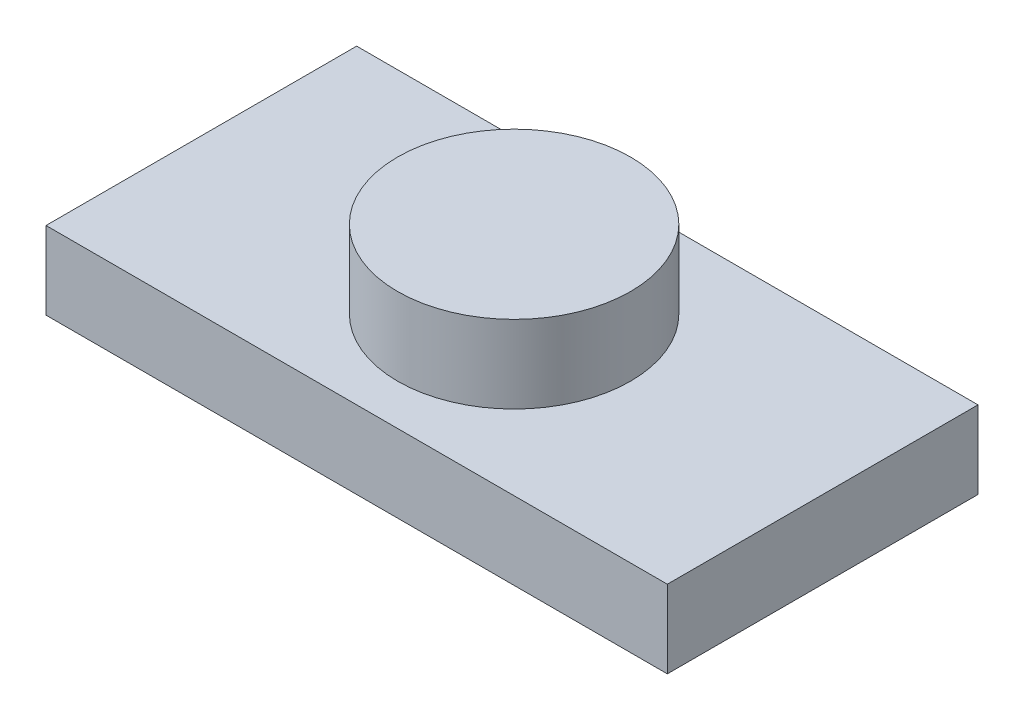
ISO-10303-21;
HEADER;
FILE_DESCRIPTION(('STEP AP214'),'2;1');
FILE_NAME('part.step','',(''),(''),'','','');
FILE_SCHEMA(('AUTOMOTIVE_DESIGN { 1 0 10303 214 1 1 1 1 }'));
ENDSEC;
DATA;
#1=APPLICATION_CONTEXT('core data for automotive mechanical design processes');
#2=APPLICATION_PROTOCOL_DEFINITION('international standard','automotive_design',2000,#1);
#3=PRODUCT_CONTEXT('',#1,'mechanical');
#4=PRODUCT('Part','Part','',(#3));
#5=PRODUCT_RELATED_PRODUCT_CATEGORY('part','',(#4));
#6=PRODUCT_DEFINITION_FORMATION('','',#4);
#7=PRODUCT_DEFINITION_CONTEXT('part definition',#1,'design');
#8=PRODUCT_DEFINITION('design','',#6,#7);
#9=PRODUCT_DEFINITION_SHAPE('','',#8);
#10=(LENGTH_UNIT() NAMED_UNIT(*) SI_UNIT(.MILLI.,.METRE.));
#11=(NAMED_UNIT(*) PLANE_ANGLE_UNIT() SI_UNIT($,.RADIAN.));
#12=(NAMED_UNIT(*) SI_UNIT($,.STERADIAN.) SOLID_ANGLE_UNIT());
#13=UNCERTAINTY_MEASURE_WITH_UNIT(LENGTH_MEASURE(1.E-05),#10,'distance_accuracy_value','');
#14=(GEOMETRIC_REPRESENTATION_CONTEXT(3) GLOBAL_UNCERTAINTY_ASSIGNED_CONTEXT((#13)) GLOBAL_UNIT_ASSIGNED_CONTEXT((#10,
#11,#12)) REPRESENTATION_CONTEXT('',''));
#15=CARTESIAN_POINT('',(0.,0.,0.));
#16=DIRECTION('',(0.,0.,1.));
#17=DIRECTION('',(1.,0.,0.));
#18=AXIS2_PLACEMENT_3D('',#15,#16,#17);
#19=CARTESIAN_POINT('',(20.,0.622119815668205,20.));
#20=DIRECTION('',(-1.,0.,0.));
#21=DIRECTION('',(0.,0.,1.));
#22=AXIS2_PLACEMENT_3D('',#19,#20,#21);
#23=PLANE('',#22);
#24=DIRECTION('',(0.,1.,0.));
#25=VECTOR('',#24,1.);
#26=CARTESIAN_POINT('',(20.,0.622119815668205,0.));
#27=LINE('',#26,#25);
#28=CARTESIAN_POINT('',(20.,0.622119815668205,0.));
#29=VERTEX_POINT('',#28);
#30=CARTESIAN_POINT('',(20.,5.6221198156682,0.));
#31=VERTEX_POINT('',#30);
#32=EDGE_CURVE('E109',#29,#31,#27,.T.);
#33=ORIENTED_EDGE('',*,*,#32,.T.);
#34=DIRECTION('',(0.,0.,-1.));
#35=VECTOR('',#34,1.);
#36=CARTESIAN_POINT('',(20.,5.6221198156682,20.));
#37=LINE('',#36,#35);
#38=CARTESIAN_POINT('',(20.,5.6221198156682,20.));
#39=VERTEX_POINT('',#38);
#40=EDGE_CURVE('E46',#39,#31,#37,.T.);
#41=ORIENTED_EDGE('',*,*,#40,.F.);
#42=DIRECTION('',(0.,1.,0.));
#43=VECTOR('',#42,1.);
#44=CARTESIAN_POINT('',(20.,0.622119815668205,20.));
#45=LINE('',#44,#43);
#46=CARTESIAN_POINT('',(20.,0.622119815668205,20.));
#47=VERTEX_POINT('',#46);
#48=EDGE_CURVE('E96',#47,#39,#45,.T.);
#49=ORIENTED_EDGE('',*,*,#48,.F.);
#50=DIRECTION('',(0.,0.,-1.));
#51=VECTOR('',#50,1.);
#52=CARTESIAN_POINT('',(20.,0.622119815668205,20.));
#53=LINE('',#52,#51);
#54=EDGE_CURVE('E105',#47,#29,#53,.T.);
#55=ORIENTED_EDGE('',*,*,#54,.T.);
#56=EDGE_LOOP('',(#33,#41,#49,#55));
#57=FACE_BOUND('',#56,.T.);
#58=ADVANCED_FACE('F43',(#57),#23,.F.);
#59=CARTESIAN_POINT('',(-20.,5.6221198156682,20.));
#60=DIRECTION('',(0.,-1.,0.));
#61=DIRECTION('',(0.,0.,-1.));
#62=AXIS2_PLACEMENT_3D('',#59,#60,#61);
#63=PLANE('',#62);
#64=CARTESIAN_POINT('',(0.,5.6221198156682,9.86491624432913));
#65=DIRECTION('',(0.,1.,0.));
#66=DIRECTION('',(0.,0.,1.));
#67=AXIS2_PLACEMENT_3D('',#64,#65,#66);
#68=CIRCLE('',#67,7.5);
#69=CARTESIAN_POINT('',(0.,5.6221198156682,17.3649162443291));
#70=VERTEX_POINT('',#69);
#71=EDGE_CURVE('E11',#70,#70,#68,.T.);
#72=ORIENTED_EDGE('',*,*,#71,.F.);
#73=EDGE_LOOP('',(#72));
#74=FACE_BOUND('',#73,.T.);
#75=DIRECTION('',(-1.,0.,0.));
#76=VECTOR('',#75,1.);
#77=CARTESIAN_POINT('',(-20.,5.6221198156682,0.));
#78=LINE('',#77,#76);
#79=CARTESIAN_POINT('',(-20.,5.6221198156682,0.));
#80=VERTEX_POINT('',#79);
#81=EDGE_CURVE('E101',#31,#80,#78,.T.);
#82=ORIENTED_EDGE('',*,*,#81,.T.);
#83=DIRECTION('',(0.,0.,-1.));
#84=VECTOR('',#83,1.);
#85=CARTESIAN_POINT('',(-20.,5.6221198156682,20.));
#86=LINE('',#85,#84);
#87=CARTESIAN_POINT('',(-20.,5.6221198156682,20.));
#88=VERTEX_POINT('',#87);
#89=EDGE_CURVE('E99',#88,#80,#86,.T.);
#90=ORIENTED_EDGE('',*,*,#89,.F.);
#91=DIRECTION('',(-1.,0.,0.));
#92=VECTOR('',#91,1.);
#93=CARTESIAN_POINT('',(-20.,5.6221198156682,20.));
#94=LINE('',#93,#92);
#95=EDGE_CURVE('E91',#39,#88,#94,.T.);
#96=ORIENTED_EDGE('',*,*,#95,.F.);
#97=ORIENTED_EDGE('',*,*,#40,.T.);
#98=EDGE_LOOP('',(#82,#90,#96,#97));
#99=FACE_BOUND('',#98,.T.);
#100=ADVANCED_FACE('F100',(#74,#99),#63,.F.);
#101=CARTESIAN_POINT('',(-20.,0.622119815668205,20.));
#102=DIRECTION('',(1.,0.,0.));
#103=DIRECTION('',(0.,0.,-1.));
#104=AXIS2_PLACEMENT_3D('',#101,#102,#103);
#105=PLANE('',#104);
#106=DIRECTION('',(0.,-1.,0.));
#107=VECTOR('',#106,1.);
#108=CARTESIAN_POINT('',(-20.,0.622119815668205,0.));
#109=LINE('',#108,#107);
#110=CARTESIAN_POINT('',(-20.,0.622119815668205,0.));
#111=VERTEX_POINT('',#110);
#112=EDGE_CURVE('E77',#80,#111,#109,.T.);
#113=ORIENTED_EDGE('',*,*,#112,.T.);
#114=DIRECTION('',(0.,0.,-1.));
#115=VECTOR('',#114,1.);
#116=CARTESIAN_POINT('',(-20.,0.622119815668205,20.));
#117=LINE('',#116,#115);
#118=CARTESIAN_POINT('',(-20.,0.622119815668205,20.));
#119=VERTEX_POINT('',#118);
#120=EDGE_CURVE('E102',#119,#111,#117,.T.);
#121=ORIENTED_EDGE('',*,*,#120,.F.);
#122=DIRECTION('',(0.,-1.,0.));
#123=VECTOR('',#122,1.);
#124=CARTESIAN_POINT('',(-20.,0.622119815668205,20.));
#125=LINE('',#124,#123);
#126=EDGE_CURVE('E94',#88,#119,#125,.T.);
#127=ORIENTED_EDGE('',*,*,#126,.F.);
#128=ORIENTED_EDGE('',*,*,#89,.T.);
#129=EDGE_LOOP('',(#113,#121,#127,#128));
#130=FACE_BOUND('',#129,.T.);
#131=ADVANCED_FACE('F103',(#130),#105,.F.);
#132=CARTESIAN_POINT('',(-20.,0.622119815668205,20.));
#133=DIRECTION('',(0.,1.,0.));
#134=DIRECTION('',(0.,0.,1.));
#135=AXIS2_PLACEMENT_3D('',#132,#133,#134);
#136=PLANE('',#135);
#137=DIRECTION('',(1.,0.,0.));
#138=VECTOR('',#137,1.);
#139=CARTESIAN_POINT('',(-20.,0.622119815668205,0.));
#140=LINE('',#139,#138);
#141=EDGE_CURVE('E83',#111,#29,#140,.T.);
#142=ORIENTED_EDGE('',*,*,#141,.T.);
#143=ORIENTED_EDGE('',*,*,#54,.F.);
#144=DIRECTION('',(1.,0.,0.));
#145=VECTOR('',#144,1.);
#146=CARTESIAN_POINT('',(-20.,0.622119815668205,20.));
#147=LINE('',#146,#145);
#148=EDGE_CURVE('E60',#119,#47,#147,.T.);
#149=ORIENTED_EDGE('',*,*,#148,.F.);
#150=ORIENTED_EDGE('',*,*,#120,.T.);
#151=EDGE_LOOP('',(#142,#143,#149,#150));
#152=FACE_BOUND('',#151,.T.);
#153=ADVANCED_FACE('F117',(#152),#136,.F.);
#154=CARTESIAN_POINT('',(0.,0.,20.));
#155=DIRECTION('',(0.,0.,-1.));
#156=DIRECTION('',(-1.,0.,0.));
#157=AXIS2_PLACEMENT_3D('',#154,#155,#156);
#158=PLANE('',#157);
#159=ORIENTED_EDGE('',*,*,#48,.T.);
#160=ORIENTED_EDGE('',*,*,#95,.T.);
#161=ORIENTED_EDGE('',*,*,#126,.T.);
#162=ORIENTED_EDGE('',*,*,#148,.T.);
#163=EDGE_LOOP('',(#159,#160,#161,#162));
#164=FACE_BOUND('',#163,.T.);
#165=ADVANCED_FACE('F92',(#164),#158,.F.);
#166=CARTESIAN_POINT('',(0.,0.,0.));
#167=DIRECTION('',(0.,0.,-1.));
#168=DIRECTION('',(-1.,0.,0.));
#169=AXIS2_PLACEMENT_3D('',#166,#167,#168);
#170=PLANE('',#169);
#171=ORIENTED_EDGE('',*,*,#32,.F.);
#172=ORIENTED_EDGE('',*,*,#141,.F.);
#173=ORIENTED_EDGE('',*,*,#112,.F.);
#174=ORIENTED_EDGE('',*,*,#81,.F.);
#175=EDGE_LOOP('',(#171,#172,#173,#174));
#176=FACE_BOUND('',#175,.T.);
#177=ADVANCED_FACE('F120',(#176),#170,.T.);
#178=CARTESIAN_POINT('',(0.,10.6221198156682,9.86491624432913));
#179=DIRECTION('',(0.,-1.,0.));
#180=DIRECTION('',(0.,0.,-1.));
#181=AXIS2_PLACEMENT_3D('',#178,#179,#180);
#182=CYLINDRICAL_SURFACE('',#181,7.5);
#183=CARTESIAN_POINT('',(0.,10.6221198156682,9.86491624432913));
#184=DIRECTION('',(0.,1.,0.));
#185=DIRECTION('',(0.,0.,1.));
#186=AXIS2_PLACEMENT_3D('',#183,#184,#185);
#187=CIRCLE('',#186,7.5);
#188=CARTESIAN_POINT('',(0.,10.6221198156682,17.3649162443291));
#189=VERTEX_POINT('',#188);
#190=EDGE_CURVE('E112',#189,#189,#187,.T.);
#191=ORIENTED_EDGE('',*,*,#190,.F.);
#192=EDGE_LOOP('',(#191));
#193=FACE_BOUND('',#192,.T.);
#194=ORIENTED_EDGE('',*,*,#71,.T.);
#195=EDGE_LOOP('',(#194));
#196=FACE_BOUND('',#195,.T.);
#197=ADVANCED_FACE('F128',(#193,#196),#182,.T.);
#198=CARTESIAN_POINT('',(0.,10.6221198156682,9.86491624432913));
#199=DIRECTION('',(0.,1.,0.));
#200=DIRECTION('',(0.,0.,1.));
#201=AXIS2_PLACEMENT_3D('',#198,#199,#200);
#202=PLANE('',#201);
#203=ORIENTED_EDGE('',*,*,#190,.T.);
#204=EDGE_LOOP('',(#203));
#205=FACE_BOUND('',#204,.T.);
#206=ADVANCED_FACE('F126',(#205),#202,.T.);
#207=CLOSED_SHELL('',(#58,#100,#131,#153,#165,#177,#197,#206));
#208=MANIFOLD_SOLID_BREP('B2',#207);
#209=ADVANCED_BREP_SHAPE_REPRESENTATION('',(#18,#208),#14);
#210=SHAPE_DEFINITION_REPRESENTATION(#9,#209);
ENDSEC;
END-ISO-10303-21;
